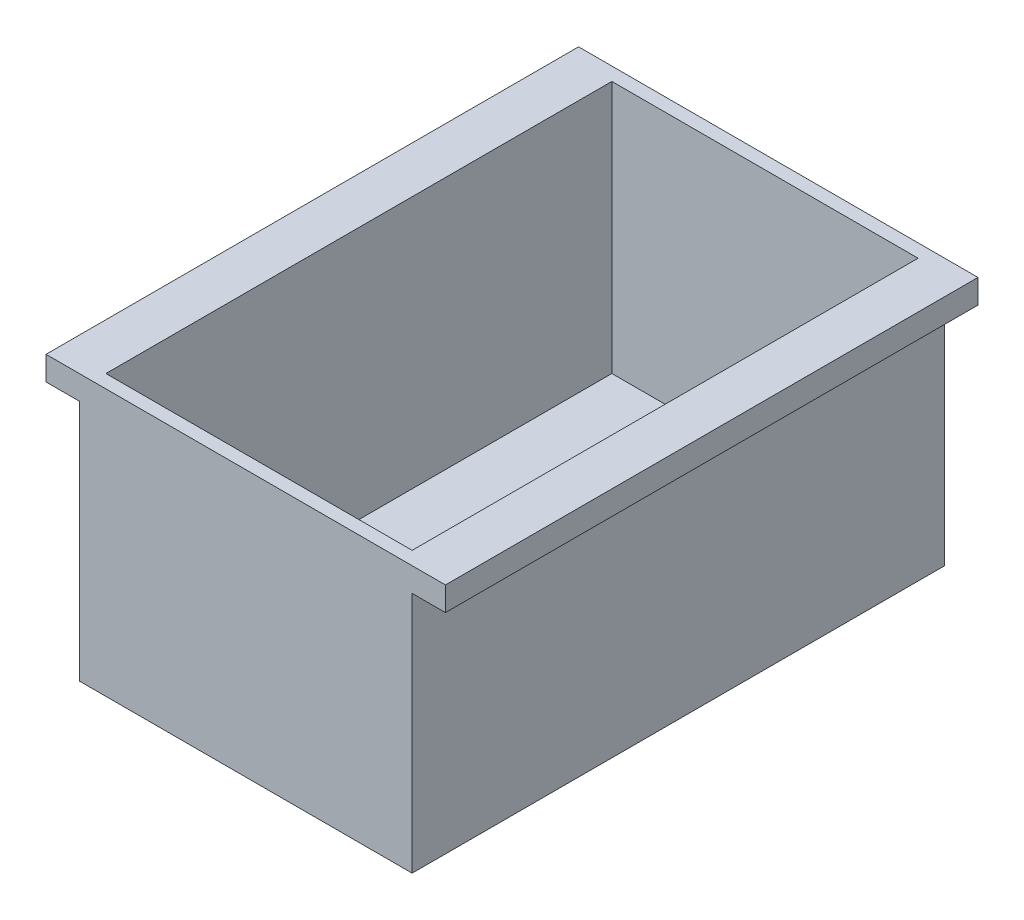
ISO-10303-21;
HEADER;
FILE_DESCRIPTION(('STEP AP214'),'2;1');
FILE_NAME('part.step','',(''),(''),'','','');
FILE_SCHEMA(('AUTOMOTIVE_DESIGN { 1 0 10303 214 1 1 1 1 }'));
ENDSEC;
DATA;
#1=APPLICATION_CONTEXT('core data for automotive mechanical design processes');
#2=APPLICATION_PROTOCOL_DEFINITION('international standard','automotive_design',2000,#1);
#3=PRODUCT_CONTEXT('',#1,'mechanical');
#4=PRODUCT('Part','Part','',(#3));
#5=PRODUCT_RELATED_PRODUCT_CATEGORY('part','',(#4));
#6=PRODUCT_DEFINITION_FORMATION('','',#4);
#7=PRODUCT_DEFINITION_CONTEXT('part definition',#1,'design');
#8=PRODUCT_DEFINITION('design','',#6,#7);
#9=PRODUCT_DEFINITION_SHAPE('','',#8);
#10=(LENGTH_UNIT() NAMED_UNIT(*) SI_UNIT(.MILLI.,.METRE.));
#11=(NAMED_UNIT(*) PLANE_ANGLE_UNIT() SI_UNIT($,.RADIAN.));
#12=(NAMED_UNIT(*) SI_UNIT($,.STERADIAN.) SOLID_ANGLE_UNIT());
#13=UNCERTAINTY_MEASURE_WITH_UNIT(LENGTH_MEASURE(1.E-05),#10,'distance_accuracy_value','');
#14=(GEOMETRIC_REPRESENTATION_CONTEXT(3) GLOBAL_UNCERTAINTY_ASSIGNED_CONTEXT((#13)) GLOBAL_UNIT_ASSIGNED_CONTEXT((#10,
#11,#12)) REPRESENTATION_CONTEXT('',''));
#15=CARTESIAN_POINT('',(0.,0.,0.));
#16=DIRECTION('',(0.,0.,1.));
#17=DIRECTION('',(1.,0.,0.));
#18=AXIS2_PLACEMENT_3D('',#15,#16,#17);
#19=CARTESIAN_POINT('',(0.,50.8,0.));
#20=DIRECTION('',(0.,-1.,0.));
#21=DIRECTION('',(0.,0.,-1.));
#22=AXIS2_PLACEMENT_3D('',#19,#20,#21);
#23=PLANE('',#22);
#24=DIRECTION('',(-1.,0.,0.));
#25=VECTOR('',#24,1.);
#26=CARTESIAN_POINT('',(0.,50.8,-101.6));
#27=LINE('',#26,#25);
#28=CARTESIAN_POINT('',(69.85,50.8,-101.6));
#29=VERTEX_POINT('',#28);
#30=CARTESIAN_POINT('',(-6.35,50.8,-101.6));
#31=VERTEX_POINT('',#30);
#32=EDGE_CURVE('E206',#29,#31,#27,.T.);
#33=ORIENTED_EDGE('',*,*,#32,.T.);
#34=DIRECTION('',(0.,0.,1.));
#35=VECTOR('',#34,1.);
#36=CARTESIAN_POINT('',(-6.35,50.8,-101.6));
#37=LINE('',#36,#35);
#38=CARTESIAN_POINT('',(-6.34999999999999,50.8,0.));
#39=VERTEX_POINT('',#38);
#40=EDGE_CURVE('E136',#31,#39,#37,.T.);
#41=ORIENTED_EDGE('',*,*,#40,.T.);
#42=DIRECTION('',(1.,0.,0.));
#43=VECTOR('',#42,1.);
#44=CARTESIAN_POINT('',(0.,50.8,0.));
#45=LINE('',#44,#43);
#46=CARTESIAN_POINT('',(69.85,50.8,0.));
#47=VERTEX_POINT('',#46);
#48=EDGE_CURVE('E204',#39,#47,#45,.T.);
#49=ORIENTED_EDGE('',*,*,#48,.T.);
#50=DIRECTION('',(0.,0.,-1.));
#51=VECTOR('',#50,1.);
#52=CARTESIAN_POINT('',(69.85,50.8,-101.6));
#53=LINE('',#52,#51);
#54=EDGE_CURVE('E154',#47,#29,#53,.T.);
#55=ORIENTED_EDGE('',*,*,#54,.T.);
#56=EDGE_LOOP('',(#33,#41,#49,#55));
#57=FACE_BOUND('',#56,.T.);
#58=DIRECTION('',(0.,0.,1.));
#59=VECTOR('',#58,1.);
#60=CARTESIAN_POINT('',(2.54,50.8,0.));
#61=LINE('',#60,#59);
#62=CARTESIAN_POINT('',(2.54,50.8,-99.06));
#63=VERTEX_POINT('',#62);
#64=CARTESIAN_POINT('',(2.54,50.8,-2.54));
#65=VERTEX_POINT('',#64);
#66=EDGE_CURVE('E196',#63,#65,#61,.T.);
#67=ORIENTED_EDGE('',*,*,#66,.F.);
#68=DIRECTION('',(-1.,0.,0.));
#69=VECTOR('',#68,1.);
#70=CARTESIAN_POINT('',(0.,50.8,-99.06));
#71=LINE('',#70,#69);
#72=CARTESIAN_POINT('',(60.96,50.8,-99.06));
#73=VERTEX_POINT('',#72);
#74=EDGE_CURVE('E186',#73,#63,#71,.T.);
#75=ORIENTED_EDGE('',*,*,#74,.F.);
#76=DIRECTION('',(0.,0.,-1.));
#77=VECTOR('',#76,1.);
#78=CARTESIAN_POINT('',(60.96,50.8,0.));
#79=LINE('',#78,#77);
#80=CARTESIAN_POINT('',(60.96,50.8,-2.54));
#81=VERTEX_POINT('',#80);
#82=EDGE_CURVE('E200',#81,#73,#79,.T.);
#83=ORIENTED_EDGE('',*,*,#82,.F.);
#84=DIRECTION('',(1.,0.,0.));
#85=VECTOR('',#84,1.);
#86=CARTESIAN_POINT('',(0.,50.8,-2.54));
#87=LINE('',#86,#85);
#88=EDGE_CURVE('E198',#65,#81,#87,.T.);
#89=ORIENTED_EDGE('',*,*,#88,.F.);
#90=EDGE_LOOP('',(#67,#75,#83,#89));
#91=FACE_BOUND('',#90,.T.);
#92=ADVANCED_FACE('F39',(#57,#91),#23,.F.);
#93=CARTESIAN_POINT('',(0.,50.8,0.));
#94=DIRECTION('',(1.,0.,0.));
#95=DIRECTION('',(0.,0.,-1.));
#96=AXIS2_PLACEMENT_3D('',#93,#94,#95);
#97=PLANE('',#96);
#98=DIRECTION('',(0.,-1.,0.));
#99=VECTOR('',#98,1.);
#100=CARTESIAN_POINT('',(0.,50.8,0.));
#101=LINE('',#100,#99);
#102=CARTESIAN_POINT('',(0.,46.228,0.));
#103=VERTEX_POINT('',#102);
#104=CARTESIAN_POINT('',(0.,0.,0.));
#105=VERTEX_POINT('',#104);
#106=EDGE_CURVE('E11',#103,#105,#101,.T.);
#107=ORIENTED_EDGE('',*,*,#106,.F.);
#108=DIRECTION('',(0.,0.,-1.));
#109=VECTOR('',#108,1.);
#110=CARTESIAN_POINT('',(0.,46.228,-101.6));
#111=LINE('',#110,#109);
#112=CARTESIAN_POINT('',(0.,46.228,-101.6));
#113=VERTEX_POINT('',#112);
#114=EDGE_CURVE('E148',#103,#113,#111,.T.);
#115=ORIENTED_EDGE('',*,*,#114,.T.);
#116=DIRECTION('',(0.,-1.,0.));
#117=VECTOR('',#116,1.);
#118=CARTESIAN_POINT('',(0.,50.8,-101.6));
#119=LINE('',#118,#117);
#120=CARTESIAN_POINT('',(0.,0.,-101.6));
#121=VERTEX_POINT('',#120);
#122=EDGE_CURVE('E147',#113,#121,#119,.T.);
#123=ORIENTED_EDGE('',*,*,#122,.T.);
#124=DIRECTION('',(0.,0.,1.));
#125=VECTOR('',#124,1.);
#126=CARTESIAN_POINT('',(0.,0.,0.));
#127=LINE('',#126,#125);
#128=EDGE_CURVE('E180',#121,#105,#127,.T.);
#129=ORIENTED_EDGE('',*,*,#128,.T.);
#130=EDGE_LOOP('',(#107,#115,#123,#129));
#131=FACE_BOUND('',#130,.T.);
#132=ADVANCED_FACE('F41',(#131),#97,.F.);
#133=CARTESIAN_POINT('',(0.,50.8,0.));
#134=DIRECTION('',(0.,0.,-1.));
#135=DIRECTION('',(-1.,0.,0.));
#136=AXIS2_PLACEMENT_3D('',#133,#134,#135);
#137=PLANE('',#136);
#138=DIRECTION('',(1.,0.,0.));
#139=VECTOR('',#138,1.);
#140=CARTESIAN_POINT('',(0.,0.,0.));
#141=LINE('',#140,#139);
#142=CARTESIAN_POINT('',(63.5,0.,0.));
#143=VERTEX_POINT('',#142);
#144=EDGE_CURVE('E211',#105,#143,#141,.T.);
#145=ORIENTED_EDGE('',*,*,#144,.T.);
#146=DIRECTION('',(0.,-1.,0.));
#147=VECTOR('',#146,1.);
#148=CARTESIAN_POINT('',(63.5,50.8,0.));
#149=LINE('',#148,#147);
#150=CARTESIAN_POINT('',(63.5,46.228,0.));
#151=VERTEX_POINT('',#150);
#152=EDGE_CURVE('E47',#151,#143,#149,.T.);
#153=ORIENTED_EDGE('',*,*,#152,.F.);
#154=DIRECTION('',(1.,0.,0.));
#155=VECTOR('',#154,1.);
#156=CARTESIAN_POINT('',(63.5,46.228,0.));
#157=LINE('',#156,#155);
#158=CARTESIAN_POINT('',(69.85,46.228,0.));
#159=VERTEX_POINT('',#158);
#160=EDGE_CURVE('E62',#151,#159,#157,.T.);
#161=ORIENTED_EDGE('',*,*,#160,.T.);
#162=DIRECTION('',(0.,1.,0.));
#163=VECTOR('',#162,1.);
#164=CARTESIAN_POINT('',(69.85,46.228,0.));
#165=LINE('',#164,#163);
#166=EDGE_CURVE('E157',#159,#47,#165,.T.);
#167=ORIENTED_EDGE('',*,*,#166,.T.);
#168=ORIENTED_EDGE('',*,*,#48,.F.);
#169=DIRECTION('',(0.,1.,0.));
#170=VECTOR('',#169,1.);
#171=CARTESIAN_POINT('',(-6.34999999999999,46.228,0.));
#172=LINE('',#171,#170);
#173=CARTESIAN_POINT('',(-6.34999999999999,46.228,0.));
#174=VERTEX_POINT('',#173);
#175=EDGE_CURVE('E138',#174,#39,#172,.T.);
#176=ORIENTED_EDGE('',*,*,#175,.F.);
#177=DIRECTION('',(1.,0.,0.));
#178=VECTOR('',#177,1.);
#179=CARTESIAN_POINT('',(0.,46.228,0.));
#180=LINE('',#179,#178);
#181=EDGE_CURVE('E139',#174,#103,#180,.T.);
#182=ORIENTED_EDGE('',*,*,#181,.T.);
#183=ORIENTED_EDGE('',*,*,#106,.T.);
#184=EDGE_LOOP('',(#145,#153,#161,#167,#168,#176,#182,#183));
#185=FACE_BOUND('',#184,.T.);
#186=ADVANCED_FACE('F228',(#185),#137,.F.);
#187=CARTESIAN_POINT('',(63.5,50.8,0.));
#188=DIRECTION('',(-1.,0.,0.));
#189=DIRECTION('',(0.,0.,1.));
#190=AXIS2_PLACEMENT_3D('',#187,#188,#189);
#191=PLANE('',#190);
#192=DIRECTION('',(0.,-1.,0.));
#193=VECTOR('',#192,1.);
#194=CARTESIAN_POINT('',(63.5,50.8,-101.6));
#195=LINE('',#194,#193);
#196=CARTESIAN_POINT('',(63.5,46.228,-101.6));
#197=VERTEX_POINT('',#196);
#198=CARTESIAN_POINT('',(63.5,0.,-101.6));
#199=VERTEX_POINT('',#198);
#200=EDGE_CURVE('E219',#197,#199,#195,.T.);
#201=ORIENTED_EDGE('',*,*,#200,.F.);
#202=DIRECTION('',(0.,0.,1.));
#203=VECTOR('',#202,1.);
#204=CARTESIAN_POINT('',(63.5,46.228,-101.6));
#205=LINE('',#204,#203);
#206=EDGE_CURVE('E166',#197,#151,#205,.T.);
#207=ORIENTED_EDGE('',*,*,#206,.T.);
#208=ORIENTED_EDGE('',*,*,#152,.T.);
#209=DIRECTION('',(0.,0.,-1.));
#210=VECTOR('',#209,1.);
#211=CARTESIAN_POINT('',(63.5,0.,0.));
#212=LINE('',#211,#210);
#213=EDGE_CURVE('E214',#143,#199,#212,.T.);
#214=ORIENTED_EDGE('',*,*,#213,.T.);
#215=EDGE_LOOP('',(#201,#207,#208,#214));
#216=FACE_BOUND('',#215,.T.);
#217=ADVANCED_FACE('F223',(#216),#191,.F.);
#218=CARTESIAN_POINT('',(0.,50.8,-101.6));
#219=DIRECTION('',(0.,0.,1.));
#220=DIRECTION('',(1.,0.,0.));
#221=AXIS2_PLACEMENT_3D('',#218,#219,#220);
#222=PLANE('',#221);
#223=DIRECTION('',(-1.,0.,0.));
#224=VECTOR('',#223,1.);
#225=CARTESIAN_POINT('',(0.,0.,-101.6));
#226=LINE('',#225,#224);
#227=EDGE_CURVE('E207',#199,#121,#226,.T.);
#228=ORIENTED_EDGE('',*,*,#227,.T.);
#229=ORIENTED_EDGE('',*,*,#122,.F.);
#230=DIRECTION('',(-1.,0.,0.));
#231=VECTOR('',#230,1.);
#232=CARTESIAN_POINT('',(0.,46.228,-101.6));
#233=LINE('',#232,#231);
#234=CARTESIAN_POINT('',(-6.35,46.228,-101.6));
#235=VERTEX_POINT('',#234);
#236=EDGE_CURVE('E54',#113,#235,#233,.T.);
#237=ORIENTED_EDGE('',*,*,#236,.T.);
#238=DIRECTION('',(0.,1.,0.));
#239=VECTOR('',#238,1.);
#240=CARTESIAN_POINT('',(-6.35,46.228,-101.6));
#241=LINE('',#240,#239);
#242=EDGE_CURVE('E130',#235,#31,#241,.T.);
#243=ORIENTED_EDGE('',*,*,#242,.T.);
#244=ORIENTED_EDGE('',*,*,#32,.F.);
#245=DIRECTION('',(0.,1.,0.));
#246=VECTOR('',#245,1.);
#247=CARTESIAN_POINT('',(69.85,46.228,-101.6));
#248=LINE('',#247,#246);
#249=CARTESIAN_POINT('',(69.85,46.228,-101.6));
#250=VERTEX_POINT('',#249);
#251=EDGE_CURVE('E161',#250,#29,#248,.T.);
#252=ORIENTED_EDGE('',*,*,#251,.F.);
#253=DIRECTION('',(-1.,0.,0.));
#254=VECTOR('',#253,1.);
#255=CARTESIAN_POINT('',(63.5,46.228,-101.6));
#256=LINE('',#255,#254);
#257=EDGE_CURVE('E160',#250,#197,#256,.T.);
#258=ORIENTED_EDGE('',*,*,#257,.T.);
#259=ORIENTED_EDGE('',*,*,#200,.T.);
#260=EDGE_LOOP('',(#228,#229,#237,#243,#244,#252,#258,#259));
#261=FACE_BOUND('',#260,.T.);
#262=ADVANCED_FACE('F146',(#261),#222,.F.);
#263=CARTESIAN_POINT('',(0.,0.,0.));
#264=DIRECTION('',(0.,-1.,0.));
#265=DIRECTION('',(0.,0.,-1.));
#266=AXIS2_PLACEMENT_3D('',#263,#264,#265);
#267=PLANE('',#266);
#268=ORIENTED_EDGE('',*,*,#128,.F.);
#269=ORIENTED_EDGE('',*,*,#227,.F.);
#270=ORIENTED_EDGE('',*,*,#213,.F.);
#271=ORIENTED_EDGE('',*,*,#144,.F.);
#272=EDGE_LOOP('',(#268,#269,#270,#271));
#273=FACE_BOUND('',#272,.T.);
#274=ADVANCED_FACE('F232',(#273),#267,.T.);
#275=CARTESIAN_POINT('',(2.54,50.8,0.));
#276=DIRECTION('',(1.,0.,0.));
#277=DIRECTION('',(0.,0.,-1.));
#278=AXIS2_PLACEMENT_3D('',#275,#276,#277);
#279=PLANE('',#278);
#280=DIRECTION('',(0.,0.,1.));
#281=VECTOR('',#280,1.);
#282=CARTESIAN_POINT('',(2.54,2.54,0.));
#283=LINE('',#282,#281);
#284=CARTESIAN_POINT('',(2.54,2.54,-99.06));
#285=VERTEX_POINT('',#284);
#286=CARTESIAN_POINT('',(2.54,2.54,-2.54));
#287=VERTEX_POINT('',#286);
#288=EDGE_CURVE('E155',#285,#287,#283,.T.);
#289=ORIENTED_EDGE('',*,*,#288,.F.);
#290=DIRECTION('',(0.,-1.,0.));
#291=VECTOR('',#290,1.);
#292=CARTESIAN_POINT('',(2.54,50.8,-99.06));
#293=LINE('',#292,#291);
#294=EDGE_CURVE('E182',#63,#285,#293,.T.);
#295=ORIENTED_EDGE('',*,*,#294,.F.);
#296=ORIENTED_EDGE('',*,*,#66,.T.);
#297=DIRECTION('',(0.,-1.,0.));
#298=VECTOR('',#297,1.);
#299=CARTESIAN_POINT('',(2.54,50.8,-2.54));
#300=LINE('',#299,#298);
#301=EDGE_CURVE('E177',#65,#287,#300,.T.);
#302=ORIENTED_EDGE('',*,*,#301,.T.);
#303=EDGE_LOOP('',(#289,#295,#296,#302));
#304=FACE_BOUND('',#303,.T.);
#305=ADVANCED_FACE('F250',(#304),#279,.T.);
#306=CARTESIAN_POINT('',(0.,50.8,-2.54));
#307=DIRECTION('',(0.,0.,-1.));
#308=DIRECTION('',(-1.,0.,0.));
#309=AXIS2_PLACEMENT_3D('',#306,#307,#308);
#310=PLANE('',#309);
#311=DIRECTION('',(1.,0.,0.));
#312=VECTOR('',#311,1.);
#313=CARTESIAN_POINT('',(0.,2.54,-2.54));
#314=LINE('',#313,#312);
#315=CARTESIAN_POINT('',(60.96,2.54,-2.54));
#316=VERTEX_POINT('',#315);
#317=EDGE_CURVE('E176',#287,#316,#314,.T.);
#318=ORIENTED_EDGE('',*,*,#317,.F.);
#319=ORIENTED_EDGE('',*,*,#301,.F.);
#320=ORIENTED_EDGE('',*,*,#88,.T.);
#321=DIRECTION('',(0.,-1.,0.));
#322=VECTOR('',#321,1.);
#323=CARTESIAN_POINT('',(60.96,50.8,-2.54));
#324=LINE('',#323,#322);
#325=EDGE_CURVE('E181',#81,#316,#324,.T.);
#326=ORIENTED_EDGE('',*,*,#325,.T.);
#327=EDGE_LOOP('',(#318,#319,#320,#326));
#328=FACE_BOUND('',#327,.T.);
#329=ADVANCED_FACE('F252',(#328),#310,.T.);
#330=CARTESIAN_POINT('',(60.96,50.8,0.));
#331=DIRECTION('',(-1.,0.,0.));
#332=DIRECTION('',(0.,0.,1.));
#333=AXIS2_PLACEMENT_3D('',#330,#331,#332);
#334=PLANE('',#333);
#335=DIRECTION('',(0.,0.,-1.));
#336=VECTOR('',#335,1.);
#337=CARTESIAN_POINT('',(60.96,2.54,0.));
#338=LINE('',#337,#336);
#339=CARTESIAN_POINT('',(60.96,2.54,-99.06));
#340=VERTEX_POINT('',#339);
#341=EDGE_CURVE('E188',#316,#340,#338,.T.);
#342=ORIENTED_EDGE('',*,*,#341,.F.);
#343=ORIENTED_EDGE('',*,*,#325,.F.);
#344=ORIENTED_EDGE('',*,*,#82,.T.);
#345=DIRECTION('',(0.,-1.,0.));
#346=VECTOR('',#345,1.);
#347=CARTESIAN_POINT('',(60.96,50.8,-99.06));
#348=LINE('',#347,#346);
#349=EDGE_CURVE('E185',#73,#340,#348,.T.);
#350=ORIENTED_EDGE('',*,*,#349,.T.);
#351=EDGE_LOOP('',(#342,#343,#344,#350));
#352=FACE_BOUND('',#351,.T.);
#353=ADVANCED_FACE('F261',(#352),#334,.T.);
#354=CARTESIAN_POINT('',(0.,50.8,-99.06));
#355=DIRECTION('',(0.,0.,1.));
#356=DIRECTION('',(1.,0.,0.));
#357=AXIS2_PLACEMENT_3D('',#354,#355,#356);
#358=PLANE('',#357);
#359=DIRECTION('',(-1.,0.,0.));
#360=VECTOR('',#359,1.);
#361=CARTESIAN_POINT('',(0.,2.54,-99.06));
#362=LINE('',#361,#360);
#363=EDGE_CURVE('E192',#340,#285,#362,.T.);
#364=ORIENTED_EDGE('',*,*,#363,.F.);
#365=ORIENTED_EDGE('',*,*,#349,.F.);
#366=ORIENTED_EDGE('',*,*,#74,.T.);
#367=ORIENTED_EDGE('',*,*,#294,.T.);
#368=EDGE_LOOP('',(#364,#365,#366,#367));
#369=FACE_BOUND('',#368,.T.);
#370=ADVANCED_FACE('F259',(#369),#358,.T.);
#371=CARTESIAN_POINT('',(0.,2.54,0.));
#372=DIRECTION('',(0.,-1.,0.));
#373=DIRECTION('',(0.,0.,-1.));
#374=AXIS2_PLACEMENT_3D('',#371,#372,#373);
#375=PLANE('',#374);
#376=ORIENTED_EDGE('',*,*,#288,.T.);
#377=ORIENTED_EDGE('',*,*,#317,.T.);
#378=ORIENTED_EDGE('',*,*,#341,.T.);
#379=ORIENTED_EDGE('',*,*,#363,.T.);
#380=EDGE_LOOP('',(#376,#377,#378,#379));
#381=FACE_BOUND('',#380,.T.);
#382=ADVANCED_FACE('F256',(#381),#375,.F.);
#383=CARTESIAN_POINT('',(69.85,46.228,-101.6));
#384=DIRECTION('',(1.,0.,0.));
#385=DIRECTION('',(0.,0.,-1.));
#386=AXIS2_PLACEMENT_3D('',#383,#384,#385);
#387=PLANE('',#386);
#388=ORIENTED_EDGE('',*,*,#54,.F.);
#389=ORIENTED_EDGE('',*,*,#166,.F.);
#390=DIRECTION('',(0.,0.,-1.));
#391=VECTOR('',#390,1.);
#392=CARTESIAN_POINT('',(69.85,46.228,-101.6));
#393=LINE('',#392,#391);
#394=EDGE_CURVE('E169',#159,#250,#393,.T.);
#395=ORIENTED_EDGE('',*,*,#394,.T.);
#396=ORIENTED_EDGE('',*,*,#251,.T.);
#397=EDGE_LOOP('',(#388,#389,#395,#396));
#398=FACE_BOUND('',#397,.T.);
#399=ADVANCED_FACE('F237',(#398),#387,.T.);
#400=CARTESIAN_POINT('',(0.,46.228,0.));
#401=DIRECTION('',(0.,1.,0.));
#402=DIRECTION('',(0.,0.,1.));
#403=AXIS2_PLACEMENT_3D('',#400,#401,#402);
#404=PLANE('',#403);
#405=ORIENTED_EDGE('',*,*,#206,.F.);
#406=ORIENTED_EDGE('',*,*,#257,.F.);
#407=ORIENTED_EDGE('',*,*,#394,.F.);
#408=ORIENTED_EDGE('',*,*,#160,.F.);
#409=EDGE_LOOP('',(#405,#406,#407,#408));
#410=FACE_BOUND('',#409,.T.);
#411=ADVANCED_FACE('F234',(#410),#404,.F.);
#412=CARTESIAN_POINT('',(-6.35,46.228,-101.6));
#413=DIRECTION('',(-1.,0.,0.));
#414=DIRECTION('',(0.,0.,1.));
#415=AXIS2_PLACEMENT_3D('',#412,#413,#414);
#416=PLANE('',#415);
#417=ORIENTED_EDGE('',*,*,#40,.F.);
#418=ORIENTED_EDGE('',*,*,#242,.F.);
#419=DIRECTION('',(0.,0.,1.));
#420=VECTOR('',#419,1.);
#421=CARTESIAN_POINT('',(-6.35,46.228,-101.6));
#422=LINE('',#421,#420);
#423=EDGE_CURVE('E133',#235,#174,#422,.T.);
#424=ORIENTED_EDGE('',*,*,#423,.T.);
#425=ORIENTED_EDGE('',*,*,#175,.T.);
#426=EDGE_LOOP('',(#417,#418,#424,#425));
#427=FACE_BOUND('',#426,.T.);
#428=ADVANCED_FACE('F131',(#427),#416,.T.);
#429=CARTESIAN_POINT('',(0.,46.228,0.));
#430=DIRECTION('',(0.,-1.,0.));
#431=DIRECTION('',(0.,0.,-1.));
#432=AXIS2_PLACEMENT_3D('',#429,#430,#431);
#433=PLANE('',#432);
#434=ORIENTED_EDGE('',*,*,#114,.F.);
#435=ORIENTED_EDGE('',*,*,#181,.F.);
#436=ORIENTED_EDGE('',*,*,#423,.F.);
#437=ORIENTED_EDGE('',*,*,#236,.F.);
#438=EDGE_LOOP('',(#434,#435,#436,#437));
#439=FACE_BOUND('',#438,.T.);
#440=ADVANCED_FACE('F141',(#439),#433,.T.);
#441=CLOSED_SHELL('',(#92,#132,#186,#217,#262,#274,#305,#329,#353,#370,#382,#399,#411,#428,#440));
#442=MANIFOLD_SOLID_BREP('B2',#441);
#443=ADVANCED_BREP_SHAPE_REPRESENTATION('',(#18,#442),#14);
#444=SHAPE_DEFINITION_REPRESENTATION(#9,#443);
ENDSEC;
END-ISO-10303-21;
